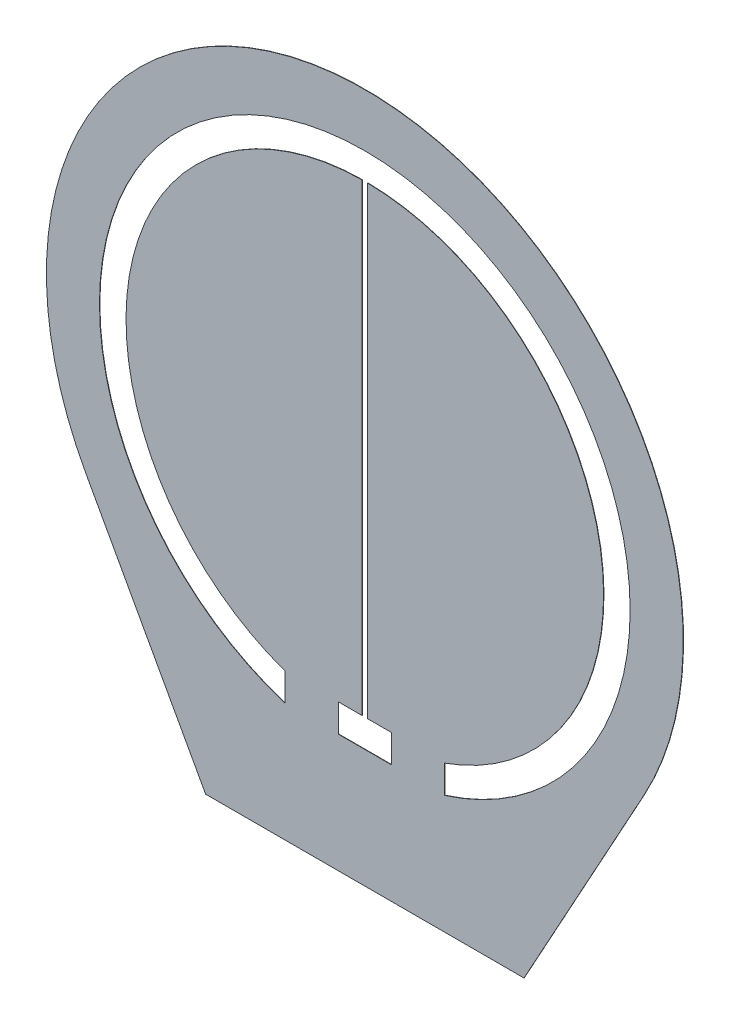
ISO-10303-21;
HEADER;
FILE_DESCRIPTION(('STEP AP214'),'2;1');
FILE_NAME('part.step','',(''),(''),'','','');
FILE_SCHEMA(('AUTOMOTIVE_DESIGN { 1 0 10303 214 1 1 1 1 }'));
ENDSEC;
DATA;
#1=APPLICATION_CONTEXT('core data for automotive mechanical design processes');
#2=APPLICATION_PROTOCOL_DEFINITION('international standard','automotive_design',2000,#1);
#3=PRODUCT_CONTEXT('',#1,'mechanical');
#4=PRODUCT('Part','Part','',(#3));
#5=PRODUCT_RELATED_PRODUCT_CATEGORY('part','',(#4));
#6=PRODUCT_DEFINITION_FORMATION('','',#4);
#7=PRODUCT_DEFINITION_CONTEXT('part definition',#1,'design');
#8=PRODUCT_DEFINITION('design','',#6,#7);
#9=PRODUCT_DEFINITION_SHAPE('','',#8);
#10=(LENGTH_UNIT() NAMED_UNIT(*) SI_UNIT(.MILLI.,.METRE.));
#11=(NAMED_UNIT(*) PLANE_ANGLE_UNIT() SI_UNIT($,.RADIAN.));
#12=(NAMED_UNIT(*) SI_UNIT($,.STERADIAN.) SOLID_ANGLE_UNIT());
#13=UNCERTAINTY_MEASURE_WITH_UNIT(LENGTH_MEASURE(1.E-05),#10,'distance_accuracy_value','');
#14=(GEOMETRIC_REPRESENTATION_CONTEXT(3) GLOBAL_UNCERTAINTY_ASSIGNED_CONTEXT((#13)) GLOBAL_UNIT_ASSIGNED_CONTEXT((#10,
#11,#12)) REPRESENTATION_CONTEXT('',''));
#15=CARTESIAN_POINT('',(0.,0.,0.));
#16=DIRECTION('',(0.,0.,1.));
#17=DIRECTION('',(1.,0.,0.));
#18=AXIS2_PLACEMENT_3D('',#15,#16,#17);
#19=CARTESIAN_POINT('',(26.2928846581436,-14.4459065604605,0.03556));
#20=DIRECTION('',(-0.876429488604786,0.481530218682018,0.));
#21=DIRECTION('',(-0.481530218682018,-0.876429488604786,0.));
#22=AXIS2_PLACEMENT_3D('',#19,#20,#21);
#23=PLANE('',#22);
#24=DIRECTION('',(0.481530218682018,0.876429488604786,0.));
#25=VECTOR('',#24,1.);
#26=CARTESIAN_POINT('',(26.2928846581436,-14.4459065604605,0.));
#27=LINE('',#26,#25);
#28=CARTESIAN_POINT('',(15.,-35.0000000354236,0.));
#29=VERTEX_POINT('',#28);
#30=CARTESIAN_POINT('',(26.2928846581436,-14.4459065604606,0.));
#31=VERTEX_POINT('',#30);
#32=EDGE_CURVE('E234',#29,#31,#27,.T.);
#33=ORIENTED_EDGE('',*,*,#32,.T.);
#34=DIRECTION('',(0.,0.,-1.));
#35=VECTOR('',#34,1.);
#36=CARTESIAN_POINT('',(26.2928846581436,-14.4459065604606,0.03556));
#37=LINE('',#36,#35);
#38=CARTESIAN_POINT('',(26.2928846581436,-14.4459065604606,0.03556));
#39=VERTEX_POINT('',#38);
#40=EDGE_CURVE('E11',#39,#31,#37,.T.);
#41=ORIENTED_EDGE('',*,*,#40,.F.);
#42=DIRECTION('',(0.481530218682018,0.876429488604786,0.));
#43=VECTOR('',#42,1.);
#44=CARTESIAN_POINT('',(26.2928846581436,-14.4459065604605,0.03556));
#45=LINE('',#44,#43);
#46=CARTESIAN_POINT('',(15.,-35.0000000354236,0.03556));
#47=VERTEX_POINT('',#46);
#48=EDGE_CURVE('E169',#47,#39,#45,.T.);
#49=ORIENTED_EDGE('',*,*,#48,.F.);
#50=DIRECTION('',(0.,0.,-1.));
#51=VECTOR('',#50,1.);
#52=CARTESIAN_POINT('',(15.,-35.0000000354236,0.03556));
#53=LINE('',#52,#51);
#54=EDGE_CURVE('E61',#47,#29,#53,.T.);
#55=ORIENTED_EDGE('',*,*,#54,.T.);
#56=EDGE_LOOP('',(#33,#41,#49,#55));
#57=FACE_BOUND('',#56,.T.);
#58=ADVANCED_FACE('F41',(#57),#23,.F.);
#59=CARTESIAN_POINT('',(0.,0.,0.03556));
#60=DIRECTION('',(0.,0.,-1.));
#61=DIRECTION('',(-1.,0.,0.));
#62=AXIS2_PLACEMENT_3D('',#59,#60,#61);
#63=CYLINDRICAL_SURFACE('',#62,30.);
#64=CARTESIAN_POINT('',(0.,0.,0.));
#65=DIRECTION('',(0.,0.,1.));
#66=DIRECTION('',(1.,0.,0.));
#67=AXIS2_PLACEMENT_3D('',#64,#65,#66);
#68=CIRCLE('',#67,30.);
#69=CARTESIAN_POINT('',(-26.2928846581436,-14.4459065604605,0.));
#70=VERTEX_POINT('',#69);
#71=EDGE_CURVE('E176',#31,#70,#68,.T.);
#72=ORIENTED_EDGE('',*,*,#71,.T.);
#73=DIRECTION('',(0.,0.,-1.));
#74=VECTOR('',#73,1.);
#75=CARTESIAN_POINT('',(-26.2928846581436,-14.4459065604605,0.03556));
#76=LINE('',#75,#74);
#77=CARTESIAN_POINT('',(-26.2928846581436,-14.4459065604605,0.03556));
#78=VERTEX_POINT('',#77);
#79=EDGE_CURVE('E52',#78,#70,#76,.T.);
#80=ORIENTED_EDGE('',*,*,#79,.F.);
#81=CARTESIAN_POINT('',(0.,0.,0.03556));
#82=DIRECTION('',(0.,0.,1.));
#83=DIRECTION('',(1.,0.,0.));
#84=AXIS2_PLACEMENT_3D('',#81,#82,#83);
#85=CIRCLE('',#84,30.);
#86=EDGE_CURVE('E163',#39,#78,#85,.T.);
#87=ORIENTED_EDGE('',*,*,#86,.F.);
#88=ORIENTED_EDGE('',*,*,#40,.T.);
#89=EDGE_LOOP('',(#72,#80,#87,#88));
#90=FACE_BOUND('',#89,.T.);
#91=ADVANCED_FACE('F175',(#90),#63,.T.);
#92=CARTESIAN_POINT('',(-26.2928846581436,-14.4459065604605,0.03556));
#93=DIRECTION('',(-0.876429488604787,-0.481530218682018,0.));
#94=DIRECTION('',(0.481530218682018,-0.876429488604787,0.));
#95=AXIS2_PLACEMENT_3D('',#92,#93,#94);
#96=PLANE('',#95);
#97=DIRECTION('',(-0.481530218682018,0.876429488604787,0.));
#98=VECTOR('',#97,1.);
#99=CARTESIAN_POINT('',(-26.2928846581436,-14.4459065604605,0.));
#100=LINE('',#99,#98);
#101=CARTESIAN_POINT('',(-15.,-35.0000000354236,0.));
#102=VERTEX_POINT('',#101);
#103=EDGE_CURVE('E239',#102,#70,#100,.T.);
#104=ORIENTED_EDGE('',*,*,#103,.F.);
#105=DIRECTION('',(0.,0.,-1.));
#106=VECTOR('',#105,1.);
#107=CARTESIAN_POINT('',(-15.,-35.0000000354236,0.03556));
#108=LINE('',#107,#106);
#109=CARTESIAN_POINT('',(-15.,-35.0000000354236,0.03556));
#110=VERTEX_POINT('',#109);
#111=EDGE_CURVE('E111',#110,#102,#108,.T.);
#112=ORIENTED_EDGE('',*,*,#111,.F.);
#113=DIRECTION('',(-0.481530218682018,0.876429488604787,0.));
#114=VECTOR('',#113,1.);
#115=CARTESIAN_POINT('',(-26.2928846581436,-14.4459065604605,0.03556));
#116=LINE('',#115,#114);
#117=EDGE_CURVE('E168',#110,#78,#116,.T.);
#118=ORIENTED_EDGE('',*,*,#117,.T.);
#119=ORIENTED_EDGE('',*,*,#79,.T.);
#120=EDGE_LOOP('',(#104,#112,#118,#119));
#121=FACE_BOUND('',#120,.T.);
#122=ADVANCED_FACE('F181',(#121),#96,.T.);
#123=CARTESIAN_POINT('',(0.,0.,0.03556));
#124=DIRECTION('',(0.,0.,-1.));
#125=DIRECTION('',(-1.,0.,0.));
#126=AXIS2_PLACEMENT_3D('',#123,#124,#125);
#127=CYLINDRICAL_SURFACE('',#126,25.);
#128=CARTESIAN_POINT('',(0.,0.,0.));
#129=DIRECTION('',(0.,0.,1.));
#130=DIRECTION('',(1.,0.,0.));
#131=AXIS2_PLACEMENT_3D('',#128,#129,#130);
#132=CIRCLE('',#131,25.);
#133=CARTESIAN_POINT('',(7.5,-23.8484800354236,0.));
#134=VERTEX_POINT('',#133);
#135=CARTESIAN_POINT('',(-7.5,-23.8484800354236,0.));
#136=VERTEX_POINT('',#135);
#137=EDGE_CURVE('E190',#134,#136,#132,.T.);
#138=ORIENTED_EDGE('',*,*,#137,.F.);
#139=DIRECTION('',(0.,0.,-1.));
#140=VECTOR('',#139,1.);
#141=CARTESIAN_POINT('',(7.5,-23.8484800354236,0.03556));
#142=LINE('',#141,#140);
#143=CARTESIAN_POINT('',(7.5,-23.8484800354236,0.03556));
#144=VERTEX_POINT('',#143);
#145=EDGE_CURVE('E45',#144,#134,#142,.T.);
#146=ORIENTED_EDGE('',*,*,#145,.F.);
#147=CARTESIAN_POINT('',(0.,0.,0.03556));
#148=DIRECTION('',(0.,0.,1.));
#149=DIRECTION('',(1.,0.,0.));
#150=AXIS2_PLACEMENT_3D('',#147,#148,#149);
#151=CIRCLE('',#150,25.);
#152=CARTESIAN_POINT('',(-7.5,-23.8484800354236,0.03556));
#153=VERTEX_POINT('',#152);
#154=EDGE_CURVE('E246',#144,#153,#151,.T.);
#155=ORIENTED_EDGE('',*,*,#154,.T.);
#156=DIRECTION('',(0.,0.,-1.));
#157=VECTOR('',#156,1.);
#158=CARTESIAN_POINT('',(-7.5,-23.8484800354236,0.03556));
#159=LINE('',#158,#157);
#160=EDGE_CURVE('E186',#153,#136,#159,.T.);
#161=ORIENTED_EDGE('',*,*,#160,.T.);
#162=EDGE_LOOP('',(#138,#146,#155,#161));
#163=FACE_BOUND('',#162,.T.);
#164=ADVANCED_FACE('F43',(#163),#127,.F.);
#165=CARTESIAN_POINT('',(7.50000000000002,0.,0.03556));
#166=DIRECTION('',(1.,0.,0.));
#167=DIRECTION('',(0.,1.,0.));
#168=AXIS2_PLACEMENT_3D('',#165,#166,#167);
#169=PLANE('',#168);
#170=DIRECTION('',(0.,-1.,0.));
#171=VECTOR('',#170,1.);
#172=CARTESIAN_POINT('',(7.50000000000002,0.,0.));
#173=LINE('',#172,#171);
#174=CARTESIAN_POINT('',(7.5,-21.2132034355964,0.));
#175=VERTEX_POINT('',#174);
#176=EDGE_CURVE('E194',#175,#134,#173,.T.);
#177=ORIENTED_EDGE('',*,*,#176,.F.);
#178=DIRECTION('',(0.,0.,-1.));
#179=VECTOR('',#178,1.);
#180=CARTESIAN_POINT('',(7.5,-21.2132034355964,0.03556));
#181=LINE('',#180,#179);
#182=CARTESIAN_POINT('',(7.5,-21.2132034355964,0.03556));
#183=VERTEX_POINT('',#182);
#184=EDGE_CURVE('E283',#183,#175,#181,.T.);
#185=ORIENTED_EDGE('',*,*,#184,.F.);
#186=DIRECTION('',(0.,-1.,0.));
#187=VECTOR('',#186,1.);
#188=CARTESIAN_POINT('',(7.50000000000002,0.,0.03556));
#189=LINE('',#188,#187);
#190=EDGE_CURVE('E294',#183,#144,#189,.T.);
#191=ORIENTED_EDGE('',*,*,#190,.T.);
#192=ORIENTED_EDGE('',*,*,#145,.T.);
#193=EDGE_LOOP('',(#177,#185,#191,#192));
#194=FACE_BOUND('',#193,.T.);
#195=ADVANCED_FACE('F292',(#194),#169,.T.);
#196=CARTESIAN_POINT('',(0.,0.,0.03556));
#197=DIRECTION('',(0.,0.,-1.));
#198=DIRECTION('',(-1.,0.,0.));
#199=AXIS2_PLACEMENT_3D('',#196,#197,#198);
#200=CYLINDRICAL_SURFACE('',#199,22.5);
#201=CARTESIAN_POINT('',(0.,0.,0.));
#202=DIRECTION('',(0.,0.,1.));
#203=DIRECTION('',(1.,0.,0.));
#204=AXIS2_PLACEMENT_3D('',#201,#202,#203);
#205=CIRCLE('',#204,22.5);
#206=CARTESIAN_POINT('',(0.25,22.4986110682415,0.));
#207=VERTEX_POINT('',#206);
#208=EDGE_CURVE('E198',#175,#207,#205,.T.);
#209=ORIENTED_EDGE('',*,*,#208,.T.);
#210=DIRECTION('',(0.,0.,-1.));
#211=VECTOR('',#210,1.);
#212=CARTESIAN_POINT('',(0.25,22.4986110682415,0.03556));
#213=LINE('',#212,#211);
#214=CARTESIAN_POINT('',(0.25,22.4986110682415,0.03556));
#215=VERTEX_POINT('',#214);
#216=EDGE_CURVE('E281',#215,#207,#213,.T.);
#217=ORIENTED_EDGE('',*,*,#216,.F.);
#218=CARTESIAN_POINT('',(0.,0.,0.03556));
#219=DIRECTION('',(0.,0.,1.));
#220=DIRECTION('',(1.,0.,0.));
#221=AXIS2_PLACEMENT_3D('',#218,#219,#220);
#222=CIRCLE('',#221,22.5);
#223=EDGE_CURVE('E305',#183,#215,#222,.T.);
#224=ORIENTED_EDGE('',*,*,#223,.F.);
#225=ORIENTED_EDGE('',*,*,#184,.T.);
#226=EDGE_LOOP('',(#209,#217,#224,#225));
#227=FACE_BOUND('',#226,.T.);
#228=ADVANCED_FACE('F303',(#227),#200,.T.);
#229=CARTESIAN_POINT('',(0.25,0.,0.03556));
#230=DIRECTION('',(-1.,0.,0.));
#231=DIRECTION('',(0.,0.,1.));
#232=AXIS2_PLACEMENT_3D('',#229,#230,#231);
#233=PLANE('',#232);
#234=DIRECTION('',(0.,1.,0.));
#235=VECTOR('',#234,1.);
#236=CARTESIAN_POINT('',(0.25,0.,0.));
#237=LINE('',#236,#235);
#238=CARTESIAN_POINT('',(0.25,-21.2132034355964,0.));
#239=VERTEX_POINT('',#238);
#240=EDGE_CURVE('E202',#239,#207,#237,.T.);
#241=ORIENTED_EDGE('',*,*,#240,.F.);
#242=DIRECTION('',(0.,0.,-1.));
#243=VECTOR('',#242,1.);
#244=CARTESIAN_POINT('',(0.25,-21.2132034355964,0.03556));
#245=LINE('',#244,#243);
#246=CARTESIAN_POINT('',(0.25,-21.2132034355964,0.03556));
#247=VERTEX_POINT('',#246);
#248=EDGE_CURVE('E278',#247,#239,#245,.T.);
#249=ORIENTED_EDGE('',*,*,#248,.F.);
#250=DIRECTION('',(0.,1.,0.));
#251=VECTOR('',#250,1.);
#252=CARTESIAN_POINT('',(0.25,0.,0.03556));
#253=LINE('',#252,#251);
#254=EDGE_CURVE('E308',#247,#215,#253,.T.);
#255=ORIENTED_EDGE('',*,*,#254,.T.);
#256=ORIENTED_EDGE('',*,*,#216,.T.);
#257=EDGE_LOOP('',(#241,#249,#255,#256));
#258=FACE_BOUND('',#257,.T.);
#259=ADVANCED_FACE('F309',(#258),#233,.T.);
#260=CARTESIAN_POINT('',(0.,-21.2132034355964,0.03556));
#261=DIRECTION('',(0.,1.,0.));
#262=DIRECTION('',(-1.,0.,0.));
#263=AXIS2_PLACEMENT_3D('',#260,#261,#262);
#264=PLANE('',#263);
#265=DIRECTION('',(1.,0.,0.));
#266=VECTOR('',#265,1.);
#267=CARTESIAN_POINT('',(0.,-21.2132034355964,0.));
#268=LINE('',#267,#266);
#269=CARTESIAN_POINT('',(2.5,-21.2132034355964,0.));
#270=VERTEX_POINT('',#269);
#271=EDGE_CURVE('E206',#239,#270,#268,.T.);
#272=ORIENTED_EDGE('',*,*,#271,.T.);
#273=DIRECTION('',(0.,0.,-1.));
#274=VECTOR('',#273,1.);
#275=CARTESIAN_POINT('',(2.5,-21.2132034355964,0.03556));
#276=LINE('',#275,#274);
#277=CARTESIAN_POINT('',(2.5,-21.2132034355964,0.03556));
#278=VERTEX_POINT('',#277);
#279=EDGE_CURVE('E274',#278,#270,#276,.T.);
#280=ORIENTED_EDGE('',*,*,#279,.F.);
#281=DIRECTION('',(1.,0.,0.));
#282=VECTOR('',#281,1.);
#283=CARTESIAN_POINT('',(0.,-21.2132034355964,0.03556));
#284=LINE('',#283,#282);
#285=EDGE_CURVE('E313',#247,#278,#284,.T.);
#286=ORIENTED_EDGE('',*,*,#285,.F.);
#287=ORIENTED_EDGE('',*,*,#248,.T.);
#288=EDGE_LOOP('',(#272,#280,#286,#287));
#289=FACE_BOUND('',#288,.T.);
#290=ADVANCED_FACE('F380',(#289),#264,.F.);
#291=CARTESIAN_POINT('',(2.5,0.,0.03556));
#292=DIRECTION('',(1.,0.,0.));
#293=DIRECTION('',(0.,1.,0.));
#294=AXIS2_PLACEMENT_3D('',#291,#292,#293);
#295=PLANE('',#294);
#296=DIRECTION('',(0.,-1.,0.));
#297=VECTOR('',#296,1.);
#298=CARTESIAN_POINT('',(2.5,0.,0.));
#299=LINE('',#298,#297);
#300=CARTESIAN_POINT('',(2.5,-23.8484800355964,0.));
#301=VERTEX_POINT('',#300);
#302=EDGE_CURVE('E209',#270,#301,#299,.T.);
#303=ORIENTED_EDGE('',*,*,#302,.T.);
#304=DIRECTION('',(0.,0.,-1.));
#305=VECTOR('',#304,1.);
#306=CARTESIAN_POINT('',(2.5,-23.8484800355964,0.03556));
#307=LINE('',#306,#305);
#308=CARTESIAN_POINT('',(2.5,-23.8484800355964,0.03556));
#309=VERTEX_POINT('',#308);
#310=EDGE_CURVE('E271',#309,#301,#307,.T.);
#311=ORIENTED_EDGE('',*,*,#310,.F.);
#312=DIRECTION('',(0.,-1.,0.));
#313=VECTOR('',#312,1.);
#314=CARTESIAN_POINT('',(2.5,0.,0.03556));
#315=LINE('',#314,#313);
#316=EDGE_CURVE('E317',#278,#309,#315,.T.);
#317=ORIENTED_EDGE('',*,*,#316,.F.);
#318=ORIENTED_EDGE('',*,*,#279,.T.);
#319=EDGE_LOOP('',(#303,#311,#317,#318));
#320=FACE_BOUND('',#319,.T.);
#321=ADVANCED_FACE('F376',(#320),#295,.F.);
#322=CARTESIAN_POINT('',(0.,-23.8484800355964,0.03556));
#323=DIRECTION('',(0.,1.,0.));
#324=DIRECTION('',(0.,0.,1.));
#325=AXIS2_PLACEMENT_3D('',#322,#323,#324);
#326=PLANE('',#325);
#327=DIRECTION('',(1.,0.,0.));
#328=VECTOR('',#327,1.);
#329=CARTESIAN_POINT('',(0.,-23.8484800355964,0.));
#330=LINE('',#329,#328);
#331=CARTESIAN_POINT('',(-2.5,-23.8484800355964,0.));
#332=VERTEX_POINT('',#331);
#333=EDGE_CURVE('E213',#332,#301,#330,.T.);
#334=ORIENTED_EDGE('',*,*,#333,.F.);
#335=DIRECTION('',(0.,0.,-1.));
#336=VECTOR('',#335,1.);
#337=CARTESIAN_POINT('',(-2.5,-23.8484800355964,0.03556));
#338=LINE('',#337,#336);
#339=CARTESIAN_POINT('',(-2.5,-23.8484800355964,0.03556));
#340=VERTEX_POINT('',#339);
#341=EDGE_CURVE('E268',#340,#332,#338,.T.);
#342=ORIENTED_EDGE('',*,*,#341,.F.);
#343=DIRECTION('',(1.,0.,0.));
#344=VECTOR('',#343,1.);
#345=CARTESIAN_POINT('',(0.,-23.8484800355964,0.03556));
#346=LINE('',#345,#344);
#347=EDGE_CURVE('E324',#340,#309,#346,.T.);
#348=ORIENTED_EDGE('',*,*,#347,.T.);
#349=ORIENTED_EDGE('',*,*,#310,.T.);
#350=EDGE_LOOP('',(#334,#342,#348,#349));
#351=FACE_BOUND('',#350,.T.);
#352=ADVANCED_FACE('F372',(#351),#326,.T.);
#353=CARTESIAN_POINT('',(-2.50000000000001,0.,0.03556));
#354=DIRECTION('',(1.,0.,0.));
#355=DIRECTION('',(0.,1.,0.));
#356=AXIS2_PLACEMENT_3D('',#353,#354,#355);
#357=PLANE('',#356);
#358=DIRECTION('',(0.,-1.,0.));
#359=VECTOR('',#358,1.);
#360=CARTESIAN_POINT('',(-2.50000000000001,0.,0.));
#361=LINE('',#360,#359);
#362=CARTESIAN_POINT('',(-2.5,-21.2132034355964,0.));
#363=VERTEX_POINT('',#362);
#364=EDGE_CURVE('E217',#363,#332,#361,.T.);
#365=ORIENTED_EDGE('',*,*,#364,.F.);
#366=DIRECTION('',(0.,0.,-1.));
#367=VECTOR('',#366,1.);
#368=CARTESIAN_POINT('',(-2.5,-21.2132034355964,0.03556));
#369=LINE('',#368,#367);
#370=CARTESIAN_POINT('',(-2.5,-21.2132034355964,0.03556));
#371=VERTEX_POINT('',#370);
#372=EDGE_CURVE('E265',#371,#363,#369,.T.);
#373=ORIENTED_EDGE('',*,*,#372,.F.);
#374=DIRECTION('',(0.,-1.,0.));
#375=VECTOR('',#374,1.);
#376=CARTESIAN_POINT('',(-2.50000000000001,0.,0.03556));
#377=LINE('',#376,#375);
#378=EDGE_CURVE('E328',#371,#340,#377,.T.);
#379=ORIENTED_EDGE('',*,*,#378,.T.);
#380=ORIENTED_EDGE('',*,*,#341,.T.);
#381=EDGE_LOOP('',(#365,#373,#379,#380));
#382=FACE_BOUND('',#381,.T.);
#383=ADVANCED_FACE('F368',(#382),#357,.T.);
#384=CARTESIAN_POINT('',(0.,-21.2132034355964,0.03556));
#385=DIRECTION('',(0.,1.,0.));
#386=DIRECTION('',(-1.,0.,0.));
#387=AXIS2_PLACEMENT_3D('',#384,#385,#386);
#388=PLANE('',#387);
#389=DIRECTION('',(1.,0.,0.));
#390=VECTOR('',#389,1.);
#391=CARTESIAN_POINT('',(0.,-21.2132034355964,0.));
#392=LINE('',#391,#390);
#393=CARTESIAN_POINT('',(-0.25,-21.2132034355964,0.));
#394=VERTEX_POINT('',#393);
#395=EDGE_CURVE('E221',#363,#394,#392,.T.);
#396=ORIENTED_EDGE('',*,*,#395,.T.);
#397=DIRECTION('',(0.,0.,-1.));
#398=VECTOR('',#397,1.);
#399=CARTESIAN_POINT('',(-0.25,-21.2132034355964,0.03556));
#400=LINE('',#399,#398);
#401=CARTESIAN_POINT('',(-0.25,-21.2132034355964,0.03556));
#402=VERTEX_POINT('',#401);
#403=EDGE_CURVE('E261',#402,#394,#400,.T.);
#404=ORIENTED_EDGE('',*,*,#403,.F.);
#405=DIRECTION('',(1.,0.,0.));
#406=VECTOR('',#405,1.);
#407=CARTESIAN_POINT('',(0.,-21.2132034355964,0.03556));
#408=LINE('',#407,#406);
#409=EDGE_CURVE('E332',#371,#402,#408,.T.);
#410=ORIENTED_EDGE('',*,*,#409,.F.);
#411=ORIENTED_EDGE('',*,*,#372,.T.);
#412=EDGE_LOOP('',(#396,#404,#410,#411));
#413=FACE_BOUND('',#412,.T.);
#414=ADVANCED_FACE('F364',(#413),#388,.F.);
#415=CARTESIAN_POINT('',(-0.25,0.,0.03556));
#416=DIRECTION('',(-1.,0.,0.));
#417=DIRECTION('',(0.,0.,1.));
#418=AXIS2_PLACEMENT_3D('',#415,#416,#417);
#419=PLANE('',#418);
#420=DIRECTION('',(0.,1.,0.));
#421=VECTOR('',#420,1.);
#422=CARTESIAN_POINT('',(-0.25,0.,0.));
#423=LINE('',#422,#421);
#424=CARTESIAN_POINT('',(-0.25,22.4986110682415,0.));
#425=VERTEX_POINT('',#424);
#426=EDGE_CURVE('E224',#394,#425,#423,.T.);
#427=ORIENTED_EDGE('',*,*,#426,.T.);
#428=DIRECTION('',(0.,0.,-1.));
#429=VECTOR('',#428,1.);
#430=CARTESIAN_POINT('',(-0.25,22.4986110682415,0.03556));
#431=LINE('',#430,#429);
#432=CARTESIAN_POINT('',(-0.25,22.4986110682415,0.03556));
#433=VERTEX_POINT('',#432);
#434=EDGE_CURVE('E257',#433,#425,#431,.T.);
#435=ORIENTED_EDGE('',*,*,#434,.F.);
#436=DIRECTION('',(0.,1.,0.));
#437=VECTOR('',#436,1.);
#438=CARTESIAN_POINT('',(-0.25,0.,0.03556));
#439=LINE('',#438,#437);
#440=EDGE_CURVE('E335',#402,#433,#439,.T.);
#441=ORIENTED_EDGE('',*,*,#440,.F.);
#442=ORIENTED_EDGE('',*,*,#403,.T.);
#443=EDGE_LOOP('',(#427,#435,#441,#442));
#444=FACE_BOUND('',#443,.T.);
#445=ADVANCED_FACE('F360',(#444),#419,.F.);
#446=CARTESIAN_POINT('',(0.,0.,0.03556));
#447=DIRECTION('',(0.,0.,-1.));
#448=DIRECTION('',(-1.,0.,0.));
#449=AXIS2_PLACEMENT_3D('',#446,#447,#448);
#450=CYLINDRICAL_SURFACE('',#449,22.5);
#451=CARTESIAN_POINT('',(0.,0.,0.));
#452=DIRECTION('',(0.,0.,1.));
#453=DIRECTION('',(1.,0.,0.));
#454=AXIS2_PLACEMENT_3D('',#451,#452,#453);
#455=CIRCLE('',#454,22.5);
#456=CARTESIAN_POINT('',(-7.5,-21.2132034355964,0.));
#457=VERTEX_POINT('',#456);
#458=EDGE_CURVE('E227',#425,#457,#455,.T.);
#459=ORIENTED_EDGE('',*,*,#458,.T.);
#460=DIRECTION('',(0.,0.,-1.));
#461=VECTOR('',#460,1.);
#462=CARTESIAN_POINT('',(-7.5,-21.2132034355964,0.03556));
#463=LINE('',#462,#461);
#464=CARTESIAN_POINT('',(-7.5,-21.2132034355964,0.03556));
#465=VERTEX_POINT('',#464);
#466=EDGE_CURVE('E253',#465,#457,#463,.T.);
#467=ORIENTED_EDGE('',*,*,#466,.F.);
#468=CARTESIAN_POINT('',(0.,0.,0.03556));
#469=DIRECTION('',(0.,0.,1.));
#470=DIRECTION('',(1.,0.,0.));
#471=AXIS2_PLACEMENT_3D('',#468,#469,#470);
#472=CIRCLE('',#471,22.5);
#473=EDGE_CURVE('E338',#433,#465,#472,.T.);
#474=ORIENTED_EDGE('',*,*,#473,.F.);
#475=ORIENTED_EDGE('',*,*,#434,.T.);
#476=EDGE_LOOP('',(#459,#467,#474,#475));
#477=FACE_BOUND('',#476,.T.);
#478=ADVANCED_FACE('F356',(#477),#450,.T.);
#479=CARTESIAN_POINT('',(-7.49999999999999,0.,0.03556));
#480=DIRECTION('',(1.,0.,0.));
#481=DIRECTION('',(0.,1.,0.));
#482=AXIS2_PLACEMENT_3D('',#479,#480,#481);
#483=PLANE('',#482);
#484=DIRECTION('',(0.,-1.,0.));
#485=VECTOR('',#484,1.);
#486=CARTESIAN_POINT('',(-7.49999999999999,0.,0.));
#487=LINE('',#486,#485);
#488=EDGE_CURVE('E230',#457,#136,#487,.T.);
#489=ORIENTED_EDGE('',*,*,#488,.T.);
#490=ORIENTED_EDGE('',*,*,#160,.F.);
#491=DIRECTION('',(0.,-1.,0.));
#492=VECTOR('',#491,1.);
#493=CARTESIAN_POINT('',(-7.49999999999999,0.,0.03556));
#494=LINE('',#493,#492);
#495=EDGE_CURVE('E341',#465,#153,#494,.T.);
#496=ORIENTED_EDGE('',*,*,#495,.F.);
#497=ORIENTED_EDGE('',*,*,#466,.T.);
#498=EDGE_LOOP('',(#489,#490,#496,#497));
#499=FACE_BOUND('',#498,.T.);
#500=ADVANCED_FACE('F348',(#499),#483,.F.);
#501=CARTESIAN_POINT('',(0.,-35.0000000354236,0.03556));
#502=DIRECTION('',(0.,-1.,0.));
#503=DIRECTION('',(1.,0.,0.));
#504=AXIS2_PLACEMENT_3D('',#501,#502,#503);
#505=PLANE('',#504);
#506=DIRECTION('',(-1.,0.,0.));
#507=VECTOR('',#506,1.);
#508=CARTESIAN_POINT('',(0.,-35.0000000354236,0.));
#509=LINE('',#508,#507);
#510=EDGE_CURVE('E242',#29,#102,#509,.T.);
#511=ORIENTED_EDGE('',*,*,#510,.F.);
#512=ORIENTED_EDGE('',*,*,#54,.F.);
#513=DIRECTION('',(-1.,0.,0.));
#514=VECTOR('',#513,1.);
#515=CARTESIAN_POINT('',(0.,-35.0000000354236,0.03556));
#516=LINE('',#515,#514);
#517=EDGE_CURVE('E183',#47,#110,#516,.T.);
#518=ORIENTED_EDGE('',*,*,#517,.T.);
#519=ORIENTED_EDGE('',*,*,#111,.T.);
#520=EDGE_LOOP('',(#511,#512,#518,#519));
#521=FACE_BOUND('',#520,.T.);
#522=ADVANCED_FACE('F399',(#521),#505,.T.);
#523=CARTESIAN_POINT('',(0.,0.,0.03556));
#524=DIRECTION('',(0.,0.,1.));
#525=DIRECTION('',(1.,0.,0.));
#526=AXIS2_PLACEMENT_3D('',#523,#524,#525);
#527=PLANE('',#526);
#528=ORIENTED_EDGE('',*,*,#154,.F.);
#529=ORIENTED_EDGE('',*,*,#190,.F.);
#530=ORIENTED_EDGE('',*,*,#223,.T.);
#531=ORIENTED_EDGE('',*,*,#254,.F.);
#532=ORIENTED_EDGE('',*,*,#285,.T.);
#533=ORIENTED_EDGE('',*,*,#316,.T.);
#534=ORIENTED_EDGE('',*,*,#347,.F.);
#535=ORIENTED_EDGE('',*,*,#378,.F.);
#536=ORIENTED_EDGE('',*,*,#409,.T.);
#537=ORIENTED_EDGE('',*,*,#440,.T.);
#538=ORIENTED_EDGE('',*,*,#473,.T.);
#539=ORIENTED_EDGE('',*,*,#495,.T.);
#540=EDGE_LOOP('',(#528,#529,#530,#531,#532,#533,#534,#535,#536,#537,#538,#539));
#541=FACE_BOUND('',#540,.T.);
#542=ORIENTED_EDGE('',*,*,#48,.T.);
#543=ORIENTED_EDGE('',*,*,#86,.T.);
#544=ORIENTED_EDGE('',*,*,#117,.F.);
#545=ORIENTED_EDGE('',*,*,#517,.F.);
#546=EDGE_LOOP('',(#542,#543,#544,#545));
#547=FACE_BOUND('',#546,.T.);
#548=ADVANCED_FACE('F165',(#541,#547),#527,.T.);
#549=CARTESIAN_POINT('',(0.,0.,0.));
#550=DIRECTION('',(0.,0.,1.));
#551=DIRECTION('',(1.,0.,0.));
#552=AXIS2_PLACEMENT_3D('',#549,#550,#551);
#553=PLANE('',#552);
#554=ORIENTED_EDGE('',*,*,#137,.T.);
#555=ORIENTED_EDGE('',*,*,#488,.F.);
#556=ORIENTED_EDGE('',*,*,#458,.F.);
#557=ORIENTED_EDGE('',*,*,#426,.F.);
#558=ORIENTED_EDGE('',*,*,#395,.F.);
#559=ORIENTED_EDGE('',*,*,#364,.T.);
#560=ORIENTED_EDGE('',*,*,#333,.T.);
#561=ORIENTED_EDGE('',*,*,#302,.F.);
#562=ORIENTED_EDGE('',*,*,#271,.F.);
#563=ORIENTED_EDGE('',*,*,#240,.T.);
#564=ORIENTED_EDGE('',*,*,#208,.F.);
#565=ORIENTED_EDGE('',*,*,#176,.T.);
#566=EDGE_LOOP('',(#554,#555,#556,#557,#558,#559,#560,#561,#562,#563,#564,#565));
#567=FACE_BOUND('',#566,.T.);
#568=ORIENTED_EDGE('',*,*,#32,.F.);
#569=ORIENTED_EDGE('',*,*,#510,.T.);
#570=ORIENTED_EDGE('',*,*,#103,.T.);
#571=ORIENTED_EDGE('',*,*,#71,.F.);
#572=EDGE_LOOP('',(#568,#569,#570,#571));
#573=FACE_BOUND('',#572,.T.);
#574=ADVANCED_FACE('F298',(#567,#573),#553,.F.);
#575=CLOSED_SHELL('',(#58,#91,#122,#164,#195,#228,#259,#290,#321,#352,#383,#414,#445,#478,#500,
#522,#548,#574));
#576=MANIFOLD_SOLID_BREP('B2',#575);
#577=ADVANCED_BREP_SHAPE_REPRESENTATION('',(#18,#576),#14);
#578=SHAPE_DEFINITION_REPRESENTATION(#9,#577);
ENDSEC;
END-ISO-10303-21;
